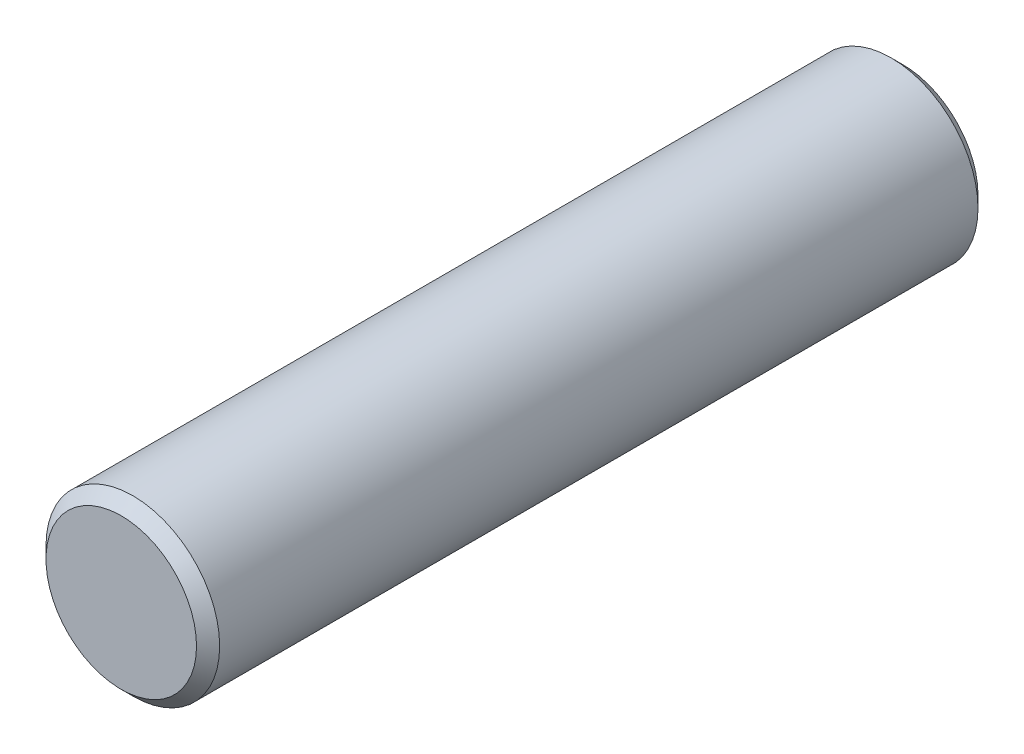
ISO-10303-21;
HEADER;
FILE_DESCRIPTION(('STEP AP214'),'2;1');
FILE_NAME('part.step','',(''),(''),'','','');
FILE_SCHEMA(('AUTOMOTIVE_DESIGN { 1 0 10303 214 1 1 1 1 }'));
ENDSEC;
DATA;
#1=APPLICATION_CONTEXT('core data for automotive mechanical design processes');
#2=APPLICATION_PROTOCOL_DEFINITION('international standard','automotive_design',2000,#1);
#3=PRODUCT_CONTEXT('',#1,'mechanical');
#4=PRODUCT('Part','Part','',(#3));
#5=PRODUCT_RELATED_PRODUCT_CATEGORY('part','',(#4));
#6=PRODUCT_DEFINITION_FORMATION('','',#4);
#7=PRODUCT_DEFINITION_CONTEXT('part definition',#1,'design');
#8=PRODUCT_DEFINITION('design','',#6,#7);
#9=PRODUCT_DEFINITION_SHAPE('','',#8);
#10=(LENGTH_UNIT() NAMED_UNIT(*) SI_UNIT(.MILLI.,.METRE.));
#11=(NAMED_UNIT(*) PLANE_ANGLE_UNIT() SI_UNIT($,.RADIAN.));
#12=(NAMED_UNIT(*) SI_UNIT($,.STERADIAN.) SOLID_ANGLE_UNIT());
#13=UNCERTAINTY_MEASURE_WITH_UNIT(LENGTH_MEASURE(1.E-05),#10,'distance_accuracy_value','');
#14=(GEOMETRIC_REPRESENTATION_CONTEXT(3) GLOBAL_UNCERTAINTY_ASSIGNED_CONTEXT((#13)) GLOBAL_UNIT_ASSIGNED_CONTEXT((#10,
#11,#12)) REPRESENTATION_CONTEXT('',''));
#15=CARTESIAN_POINT('',(0.,0.,0.));
#16=DIRECTION('',(0.,0.,1.));
#17=DIRECTION('',(1.,0.,0.));
#18=AXIS2_PLACEMENT_3D('',#15,#16,#17);
#19=CARTESIAN_POINT('',(0.,0.,10.125));
#20=DIRECTION('',(0.,0.,-1.));
#21=DIRECTION('',(-1.,0.,0.));
#22=AXIS2_PLACEMENT_3D('',#19,#20,#21);
#23=CYLINDRICAL_SURFACE('',#22,2.25);
#24=CARTESIAN_POINT('',(0.,0.,-9.825));
#25=DIRECTION('',(0.,0.,1.));
#26=DIRECTION('',(1.,0.,0.));
#27=AXIS2_PLACEMENT_3D('',#24,#25,#26);
#28=CIRCLE('',#27,2.25);
#29=CARTESIAN_POINT('',(2.25,0.,-9.825));
#30=VERTEX_POINT('',#29);
#31=EDGE_CURVE('E46',#30,#30,#28,.T.);
#32=ORIENTED_EDGE('',*,*,#31,.T.);
#33=EDGE_LOOP('',(#32));
#34=FACE_BOUND('',#33,.T.);
#35=CARTESIAN_POINT('',(0.,0.,9.82500000000001));
#36=DIRECTION('',(0.,0.,1.));
#37=DIRECTION('',(1.,0.,0.));
#38=AXIS2_PLACEMENT_3D('',#35,#36,#37);
#39=CIRCLE('',#38,2.25);
#40=CARTESIAN_POINT('',(2.25,0.,9.82500000000001));
#41=VERTEX_POINT('',#40);
#42=EDGE_CURVE('E50',#41,#41,#39,.F.);
#43=ORIENTED_EDGE('',*,*,#42,.T.);
#44=EDGE_LOOP('',(#43));
#45=FACE_BOUND('',#44,.T.);
#46=ADVANCED_FACE('F35',(#34,#45),#23,.T.);
#47=CARTESIAN_POINT('',(0.,0.,10.125));
#48=DIRECTION('',(0.,0.,1.));
#49=DIRECTION('',(1.,0.,0.));
#50=AXIS2_PLACEMENT_3D('',#47,#48,#49);
#51=PLANE('',#50);
#52=CARTESIAN_POINT('',(0.,0.,10.125));
#53=DIRECTION('',(0.,0.,1.));
#54=DIRECTION('',(1.,0.,0.));
#55=AXIS2_PLACEMENT_3D('',#52,#53,#54);
#56=CIRCLE('',#55,1.95000000000001);
#57=CARTESIAN_POINT('',(1.95000000000001,0.,10.125));
#58=VERTEX_POINT('',#57);
#59=EDGE_CURVE('E10',#58,#58,#56,.T.);
#60=ORIENTED_EDGE('',*,*,#59,.T.);
#61=EDGE_LOOP('',(#60));
#62=FACE_BOUND('',#61,.T.);
#63=ADVANCED_FACE('F66',(#62),#51,.T.);
#64=CARTESIAN_POINT('',(0.,0.,-10.125));
#65=DIRECTION('',(0.,0.,1.));
#66=DIRECTION('',(1.,0.,0.));
#67=AXIS2_PLACEMENT_3D('',#64,#65,#66);
#68=PLANE('',#67);
#69=CARTESIAN_POINT('',(0.,0.,-10.125));
#70=DIRECTION('',(0.,0.,1.));
#71=DIRECTION('',(1.,0.,0.));
#72=AXIS2_PLACEMENT_3D('',#69,#70,#71);
#73=CIRCLE('',#72,1.95);
#74=CARTESIAN_POINT('',(1.95,0.,-10.125));
#75=VERTEX_POINT('',#74);
#76=EDGE_CURVE('E42',#75,#75,#73,.F.);
#77=ORIENTED_EDGE('',*,*,#76,.T.);
#78=EDGE_LOOP('',(#77));
#79=FACE_BOUND('',#78,.T.);
#80=ADVANCED_FACE('F63',(#79),#68,.F.);
#81=CARTESIAN_POINT('',(0.,0.,-9.825));
#82=DIRECTION('',(0.,0.,1.));
#83=DIRECTION('',(1.,0.,0.));
#84=AXIS2_PLACEMENT_3D('',#81,#82,#83);
#85=CONICAL_SURFACE('',#84,2.25,0.78539816339745);
#86=ORIENTED_EDGE('',*,*,#76,.F.);
#87=EDGE_LOOP('',(#86));
#88=FACE_BOUND('',#87,.T.);
#89=ORIENTED_EDGE('',*,*,#31,.F.);
#90=EDGE_LOOP('',(#89));
#91=FACE_BOUND('',#90,.T.);
#92=ADVANCED_FACE('F59',(#88,#91),#85,.T.);
#93=CARTESIAN_POINT('',(0.,0.,10.125));
#94=DIRECTION('',(0.,0.,-1.));
#95=DIRECTION('',(-1.,0.,0.));
#96=AXIS2_PLACEMENT_3D('',#93,#94,#95);
#97=CONICAL_SURFACE('',#96,1.95000000000001,0.785398163397446);
#98=ORIENTED_EDGE('',*,*,#42,.F.);
#99=EDGE_LOOP('',(#98));
#100=FACE_BOUND('',#99,.T.);
#101=ORIENTED_EDGE('',*,*,#59,.F.);
#102=EDGE_LOOP('',(#101));
#103=FACE_BOUND('',#102,.T.);
#104=ADVANCED_FACE('F37',(#100,#103),#97,.T.);
#105=CLOSED_SHELL('',(#46,#63,#80,#92,#104));
#106=MANIFOLD_SOLID_BREP('B2',#105);
#107=ADVANCED_BREP_SHAPE_REPRESENTATION('',(#18,#106),#14);
#108=SHAPE_DEFINITION_REPRESENTATION(#9,#107);
ENDSEC;
END-ISO-10303-21;
